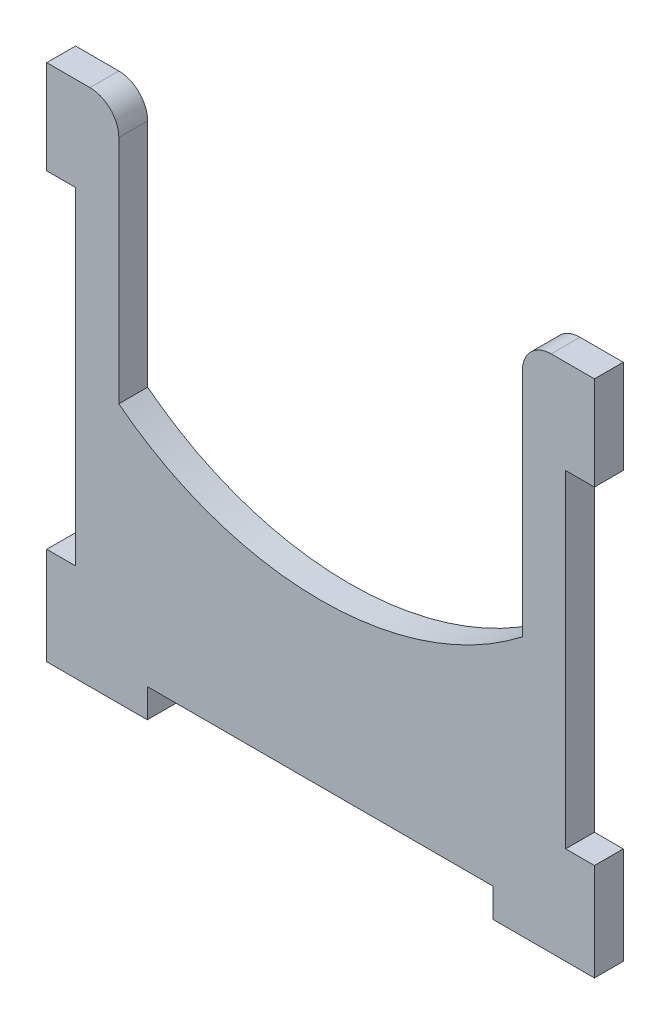
ISO-10303-21;
HEADER;
FILE_DESCRIPTION(('STEP AP214'),'2;1');
FILE_NAME('part.step','',(''),(''),'','','');
FILE_SCHEMA(('AUTOMOTIVE_DESIGN { 1 0 10303 214 1 1 1 1 }'));
ENDSEC;
DATA;
#1=APPLICATION_CONTEXT('core data for automotive mechanical design processes');
#2=APPLICATION_PROTOCOL_DEFINITION('international standard','automotive_design',2000,#1);
#3=PRODUCT_CONTEXT('',#1,'mechanical');
#4=PRODUCT('Part','Part','',(#3));
#5=PRODUCT_RELATED_PRODUCT_CATEGORY('part','',(#4));
#6=PRODUCT_DEFINITION_FORMATION('','',#4);
#7=PRODUCT_DEFINITION_CONTEXT('part definition',#1,'design');
#8=PRODUCT_DEFINITION('design','',#6,#7);
#9=PRODUCT_DEFINITION_SHAPE('','',#8);
#10=(LENGTH_UNIT() NAMED_UNIT(*) SI_UNIT(.MILLI.,.METRE.));
#11=(NAMED_UNIT(*) PLANE_ANGLE_UNIT() SI_UNIT($,.RADIAN.));
#12=(NAMED_UNIT(*) SI_UNIT($,.STERADIAN.) SOLID_ANGLE_UNIT());
#13=UNCERTAINTY_MEASURE_WITH_UNIT(LENGTH_MEASURE(1.E-05),#10,'distance_accuracy_value','');
#14=(GEOMETRIC_REPRESENTATION_CONTEXT(3) GLOBAL_UNCERTAINTY_ASSIGNED_CONTEXT((#13)) GLOBAL_UNIT_ASSIGNED_CONTEXT((#10,
#11,#12)) REPRESENTATION_CONTEXT('',''));
#15=CARTESIAN_POINT('',(0.,0.,0.));
#16=DIRECTION('',(0.,0.,1.));
#17=DIRECTION('',(1.,0.,0.));
#18=AXIS2_PLACEMENT_3D('',#15,#16,#17);
#19=CARTESIAN_POINT('',(0.,80.0783413746152,5.));
#20=DIRECTION('',(0.,1.,0.));
#21=DIRECTION('',(0.,0.,1.));
#22=AXIS2_PLACEMENT_3D('',#19,#20,#21);
#23=PLANE('',#22);
#24=DIRECTION('',(1.,0.,0.));
#25=VECTOR('',#24,1.);
#26=CARTESIAN_POINT('',(0.,80.0783413746152,0.));
#27=LINE('',#26,#25);
#28=CARTESIAN_POINT('',(26.1216712285328,80.0783413746152,0.));
#29=VERTEX_POINT('',#28);
#30=CARTESIAN_POINT('',(33.6216712285327,80.0783413746152,0.));
#31=VERTEX_POINT('',#30);
#32=EDGE_CURVE('E215',#29,#31,#27,.T.);
#33=ORIENTED_EDGE('',*,*,#32,.F.);
#34=DIRECTION('',(0.,0.,-1.));
#35=VECTOR('',#34,1.);
#36=CARTESIAN_POINT('',(26.1216712285328,80.0783413746152,5.));
#37=LINE('',#36,#35);
#38=CARTESIAN_POINT('',(26.1216712285328,80.0783413746152,5.));
#39=VERTEX_POINT('',#38);
#40=EDGE_CURVE('E11',#39,#29,#37,.T.);
#41=ORIENTED_EDGE('',*,*,#40,.F.);
#42=DIRECTION('',(1.,0.,0.));
#43=VECTOR('',#42,1.);
#44=CARTESIAN_POINT('',(0.,80.0783413746152,5.));
#45=LINE('',#44,#43);
#46=CARTESIAN_POINT('',(33.6216712285327,80.0783413746152,5.));
#47=VERTEX_POINT('',#46);
#48=EDGE_CURVE('E270',#39,#47,#45,.T.);
#49=ORIENTED_EDGE('',*,*,#48,.T.);
#50=DIRECTION('',(0.,0.,-1.));
#51=VECTOR('',#50,1.);
#52=CARTESIAN_POINT('',(33.6216712285327,80.0783413746152,5.));
#53=LINE('',#52,#51);
#54=EDGE_CURVE('E51',#47,#31,#53,.T.);
#55=ORIENTED_EDGE('',*,*,#54,.T.);
#56=EDGE_LOOP('',(#33,#41,#49,#55));
#57=FACE_BOUND('',#56,.T.);
#58=ADVANCED_FACE('F35',(#57),#23,.T.);
#59=CARTESIAN_POINT('',(26.1216712285327,75.0783413746152,5.));
#60=DIRECTION('',(0.,0.,-1.));
#61=DIRECTION('',(-1.,0.,0.));
#62=AXIS2_PLACEMENT_3D('',#59,#60,#61);
#63=CYLINDRICAL_SURFACE('',#62,5.);
#64=CARTESIAN_POINT('',(26.1216712285327,75.0783413746152,0.));
#65=DIRECTION('',(0.,0.,1.));
#66=DIRECTION('',(1.,0.,0.));
#67=AXIS2_PLACEMENT_3D('',#64,#65,#66);
#68=CIRCLE('',#67,5.);
#69=CARTESIAN_POINT('',(21.1216712285327,75.0783413746152,0.));
#70=VERTEX_POINT('',#69);
#71=EDGE_CURVE('E217',#29,#70,#68,.T.);
#72=ORIENTED_EDGE('',*,*,#71,.T.);
#73=DIRECTION('',(0.,0.,-1.));
#74=VECTOR('',#73,1.);
#75=CARTESIAN_POINT('',(21.1216712285327,75.0783413746152,5.));
#76=LINE('',#75,#74);
#77=CARTESIAN_POINT('',(21.1216712285327,75.0783413746152,5.));
#78=VERTEX_POINT('',#77);
#79=EDGE_CURVE('E43',#78,#70,#76,.T.);
#80=ORIENTED_EDGE('',*,*,#79,.F.);
#81=CARTESIAN_POINT('',(26.1216712285327,75.0783413746152,5.));
#82=DIRECTION('',(0.,0.,1.));
#83=DIRECTION('',(1.,0.,0.));
#84=AXIS2_PLACEMENT_3D('',#81,#82,#83);
#85=CIRCLE('',#84,5.);
#86=EDGE_CURVE('E333',#39,#78,#85,.T.);
#87=ORIENTED_EDGE('',*,*,#86,.F.);
#88=ORIENTED_EDGE('',*,*,#40,.T.);
#89=EDGE_LOOP('',(#72,#80,#87,#88));
#90=FACE_BOUND('',#89,.T.);
#91=ADVANCED_FACE('F321',(#90),#63,.T.);
#92=CARTESIAN_POINT('',(21.1216712285328,0.,5.));
#93=DIRECTION('',(-1.,0.,0.));
#94=DIRECTION('',(0.,-1.,0.));
#95=AXIS2_PLACEMENT_3D('',#92,#93,#94);
#96=PLANE('',#95);
#97=DIRECTION('',(0.,1.,0.));
#98=VECTOR('',#97,1.);
#99=CARTESIAN_POINT('',(21.1216712285328,0.,0.));
#100=LINE('',#99,#98);
#101=CARTESIAN_POINT('',(21.1216712285327,35.0783413746152,0.));
#102=VERTEX_POINT('',#101);
#103=EDGE_CURVE('E220',#102,#70,#100,.T.);
#104=ORIENTED_EDGE('',*,*,#103,.F.);
#105=DIRECTION('',(0.,0.,-1.));
#106=VECTOR('',#105,1.);
#107=CARTESIAN_POINT('',(21.1216712285327,35.0783413746152,5.));
#108=LINE('',#107,#106);
#109=CARTESIAN_POINT('',(21.1216712285327,35.0783413746152,5.));
#110=VERTEX_POINT('',#109);
#111=EDGE_CURVE('E311',#110,#102,#108,.T.);
#112=ORIENTED_EDGE('',*,*,#111,.F.);
#113=DIRECTION('',(0.,1.,0.));
#114=VECTOR('',#113,1.);
#115=CARTESIAN_POINT('',(21.1216712285328,0.,5.));
#116=LINE('',#115,#114);
#117=EDGE_CURVE('E318',#110,#78,#116,.T.);
#118=ORIENTED_EDGE('',*,*,#117,.T.);
#119=ORIENTED_EDGE('',*,*,#79,.T.);
#120=EDGE_LOOP('',(#104,#112,#118,#119));
#121=FACE_BOUND('',#120,.T.);
#122=ADVANCED_FACE('F316',(#121),#96,.T.);
#123=CARTESIAN_POINT('',(-13.8783287714673,80.120008041282,5.));
#124=DIRECTION('',(0.,0.,-1.));
#125=DIRECTION('',(-1.,0.,0.));
#126=AXIS2_PLACEMENT_3D('',#123,#124,#125);
#127=CYLINDRICAL_SURFACE('',#126,57.0416666666667);
#128=CARTESIAN_POINT('',(-13.8783287714673,80.120008041282,0.));
#129=DIRECTION('',(0.,0.,1.));
#130=DIRECTION('',(1.,0.,0.));
#131=AXIS2_PLACEMENT_3D('',#128,#129,#130);
#132=CIRCLE('',#131,57.0416666666667);
#133=CARTESIAN_POINT('',(-48.8783287714673,35.0783413746152,0.));
#134=VERTEX_POINT('',#133);
#135=EDGE_CURVE('E223',#134,#102,#132,.T.);
#136=ORIENTED_EDGE('',*,*,#135,.F.);
#137=DIRECTION('',(0.,0.,-1.));
#138=VECTOR('',#137,1.);
#139=CARTESIAN_POINT('',(-48.8783287714673,35.0783413746152,5.));
#140=LINE('',#139,#138);
#141=CARTESIAN_POINT('',(-48.8783287714673,35.0783413746152,5.));
#142=VERTEX_POINT('',#141);
#143=EDGE_CURVE('E309',#142,#134,#140,.T.);
#144=ORIENTED_EDGE('',*,*,#143,.F.);
#145=CARTESIAN_POINT('',(-13.8783287714673,80.120008041282,5.));
#146=DIRECTION('',(0.,0.,1.));
#147=DIRECTION('',(1.,0.,0.));
#148=AXIS2_PLACEMENT_3D('',#145,#146,#147);
#149=CIRCLE('',#148,57.0416666666667);
#150=EDGE_CURVE('E332',#142,#110,#149,.T.);
#151=ORIENTED_EDGE('',*,*,#150,.T.);
#152=ORIENTED_EDGE('',*,*,#111,.T.);
#153=EDGE_LOOP('',(#136,#144,#151,#152));
#154=FACE_BOUND('',#153,.T.);
#155=ADVANCED_FACE('F328',(#154),#127,.F.);
#156=CARTESIAN_POINT('',(-48.8783287714673,0.,5.));
#157=DIRECTION('',(-1.,0.,0.));
#158=DIRECTION('',(0.,0.,1.));
#159=AXIS2_PLACEMENT_3D('',#156,#157,#158);
#160=PLANE('',#159);
#161=DIRECTION('',(0.,1.,0.));
#162=VECTOR('',#161,1.);
#163=CARTESIAN_POINT('',(-48.8783287714673,0.,0.));
#164=LINE('',#163,#162);
#165=CARTESIAN_POINT('',(-48.8783287714673,75.0783413746152,0.));
#166=VERTEX_POINT('',#165);
#167=EDGE_CURVE('E226',#134,#166,#164,.T.);
#168=ORIENTED_EDGE('',*,*,#167,.T.);
#169=DIRECTION('',(0.,0.,-1.));
#170=VECTOR('',#169,1.);
#171=CARTESIAN_POINT('',(-48.8783287714673,75.0783413746152,5.));
#172=LINE('',#171,#170);
#173=CARTESIAN_POINT('',(-48.8783287714673,75.0783413746152,5.));
#174=VERTEX_POINT('',#173);
#175=EDGE_CURVE('E306',#174,#166,#172,.T.);
#176=ORIENTED_EDGE('',*,*,#175,.F.);
#177=DIRECTION('',(0.,1.,0.));
#178=VECTOR('',#177,1.);
#179=CARTESIAN_POINT('',(-48.8783287714673,0.,5.));
#180=LINE('',#179,#178);
#181=EDGE_CURVE('E335',#142,#174,#180,.T.);
#182=ORIENTED_EDGE('',*,*,#181,.F.);
#183=ORIENTED_EDGE('',*,*,#143,.T.);
#184=EDGE_LOOP('',(#168,#176,#182,#183));
#185=FACE_BOUND('',#184,.T.);
#186=ADVANCED_FACE('F397',(#185),#160,.F.);
#187=CARTESIAN_POINT('',(-53.8783287714673,75.0783413746152,5.));
#188=DIRECTION('',(0.,0.,-1.));
#189=DIRECTION('',(-1.,0.,0.));
#190=AXIS2_PLACEMENT_3D('',#187,#188,#189);
#191=CYLINDRICAL_SURFACE('',#190,5.);
#192=CARTESIAN_POINT('',(-53.8783287714673,75.0783413746152,0.));
#193=DIRECTION('',(0.,0.,1.));
#194=DIRECTION('',(1.,0.,0.));
#195=AXIS2_PLACEMENT_3D('',#192,#193,#194);
#196=CIRCLE('',#195,5.);
#197=CARTESIAN_POINT('',(-53.8783287714673,80.0783413746152,0.));
#198=VERTEX_POINT('',#197);
#199=EDGE_CURVE('E228',#166,#198,#196,.T.);
#200=ORIENTED_EDGE('',*,*,#199,.T.);
#201=DIRECTION('',(0.,0.,-1.));
#202=VECTOR('',#201,1.);
#203=CARTESIAN_POINT('',(-53.8783287714673,80.0783413746152,5.));
#204=LINE('',#203,#202);
#205=CARTESIAN_POINT('',(-53.8783287714673,80.0783413746152,5.));
#206=VERTEX_POINT('',#205);
#207=EDGE_CURVE('E304',#206,#198,#204,.T.);
#208=ORIENTED_EDGE('',*,*,#207,.F.);
#209=CARTESIAN_POINT('',(-53.8783287714673,75.0783413746152,5.));
#210=DIRECTION('',(0.,0.,1.));
#211=DIRECTION('',(1.,0.,0.));
#212=AXIS2_PLACEMENT_3D('',#209,#210,#211);
#213=CIRCLE('',#212,5.);
#214=EDGE_CURVE('E341',#174,#206,#213,.T.);
#215=ORIENTED_EDGE('',*,*,#214,.F.);
#216=ORIENTED_EDGE('',*,*,#175,.T.);
#217=EDGE_LOOP('',(#200,#208,#215,#216));
#218=FACE_BOUND('',#217,.T.);
#219=ADVANCED_FACE('F400',(#218),#191,.T.);
#220=CARTESIAN_POINT('',(1.48174697279819E-13,80.0783413746151,5.));
#221=DIRECTION('',(0.,1.,0.));
#222=DIRECTION('',(-1.,0.,0.));
#223=AXIS2_PLACEMENT_3D('',#220,#221,#222);
#224=PLANE('',#223);
#225=DIRECTION('',(1.,0.,0.));
#226=VECTOR('',#225,1.);
#227=CARTESIAN_POINT('',(1.48174697279819E-13,80.0783413746151,0.));
#228=LINE('',#227,#226);
#229=CARTESIAN_POINT('',(-61.3783287714673,80.0783413746152,0.));
#230=VERTEX_POINT('',#229);
#231=EDGE_CURVE('E231',#230,#198,#228,.T.);
#232=ORIENTED_EDGE('',*,*,#231,.F.);
#233=DIRECTION('',(0.,0.,-1.));
#234=VECTOR('',#233,1.);
#235=CARTESIAN_POINT('',(-61.3783287714673,80.0783413746152,5.));
#236=LINE('',#235,#234);
#237=CARTESIAN_POINT('',(-61.3783287714673,80.0783413746152,5.));
#238=VERTEX_POINT('',#237);
#239=EDGE_CURVE('E302',#238,#230,#236,.T.);
#240=ORIENTED_EDGE('',*,*,#239,.F.);
#241=DIRECTION('',(1.,0.,0.));
#242=VECTOR('',#241,1.);
#243=CARTESIAN_POINT('',(1.48174697279819E-13,80.0783413746151,5.));
#244=LINE('',#243,#242);
#245=EDGE_CURVE('E343',#238,#206,#244,.T.);
#246=ORIENTED_EDGE('',*,*,#245,.T.);
#247=ORIENTED_EDGE('',*,*,#207,.T.);
#248=EDGE_LOOP('',(#232,#240,#246,#247));
#249=FACE_BOUND('',#248,.T.);
#250=ADVANCED_FACE('F404',(#249),#224,.T.);
#251=CARTESIAN_POINT('',(-61.3783287714673,0.,5.));
#252=DIRECTION('',(1.,0.,0.));
#253=DIRECTION('',(0.,0.,-1.));
#254=AXIS2_PLACEMENT_3D('',#251,#252,#253);
#255=PLANE('',#254);
#256=DIRECTION('',(0.,-1.,0.));
#257=VECTOR('',#256,1.);
#258=CARTESIAN_POINT('',(-61.3783287714673,0.,0.));
#259=LINE('',#258,#257);
#260=CARTESIAN_POINT('',(-61.3783287714673,63.8192391119679,0.));
#261=VERTEX_POINT('',#260);
#262=EDGE_CURVE('E234',#230,#261,#259,.T.);
#263=ORIENTED_EDGE('',*,*,#262,.T.);
#264=DIRECTION('',(0.,0.,-1.));
#265=VECTOR('',#264,1.);
#266=CARTESIAN_POINT('',(-61.3783287714673,63.8192391119679,5.));
#267=LINE('',#266,#265);
#268=CARTESIAN_POINT('',(-61.3783287714673,63.8192391119679,5.));
#269=VERTEX_POINT('',#268);
#270=EDGE_CURVE('E299',#269,#261,#267,.T.);
#271=ORIENTED_EDGE('',*,*,#270,.F.);
#272=DIRECTION('',(0.,-1.,0.));
#273=VECTOR('',#272,1.);
#274=CARTESIAN_POINT('',(-61.3783287714673,0.,5.));
#275=LINE('',#274,#273);
#276=EDGE_CURVE('E346',#238,#269,#275,.T.);
#277=ORIENTED_EDGE('',*,*,#276,.F.);
#278=ORIENTED_EDGE('',*,*,#239,.T.);
#279=EDGE_LOOP('',(#263,#271,#277,#278));
#280=FACE_BOUND('',#279,.T.);
#281=ADVANCED_FACE('F408',(#280),#255,.F.);
#282=CARTESIAN_POINT('',(1.77133971690412E-13,63.8192391119677,5.));
#283=DIRECTION('',(0.,1.,0.));
#284=DIRECTION('',(-1.,0.,0.));
#285=AXIS2_PLACEMENT_3D('',#282,#283,#284);
#286=PLANE('',#285);
#287=DIRECTION('',(1.,0.,0.));
#288=VECTOR('',#287,1.);
#289=CARTESIAN_POINT('',(1.77133971690412E-13,63.8192391119677,0.));
#290=LINE('',#289,#288);
#291=CARTESIAN_POINT('',(-56.3783287714673,63.8192391119679,0.));
#292=VERTEX_POINT('',#291);
#293=EDGE_CURVE('E236',#261,#292,#290,.T.);
#294=ORIENTED_EDGE('',*,*,#293,.T.);
#295=DIRECTION('',(0.,0.,-1.));
#296=VECTOR('',#295,1.);
#297=CARTESIAN_POINT('',(-56.3783287714673,63.8192391119679,5.));
#298=LINE('',#297,#296);
#299=CARTESIAN_POINT('',(-56.3783287714673,63.8192391119679,5.));
#300=VERTEX_POINT('',#299);
#301=EDGE_CURVE('E296',#300,#292,#298,.T.);
#302=ORIENTED_EDGE('',*,*,#301,.F.);
#303=DIRECTION('',(1.,0.,0.));
#304=VECTOR('',#303,1.);
#305=CARTESIAN_POINT('',(1.77133971690412E-13,63.8192391119677,5.));
#306=LINE('',#305,#304);
#307=EDGE_CURVE('E348',#269,#300,#306,.T.);
#308=ORIENTED_EDGE('',*,*,#307,.F.);
#309=ORIENTED_EDGE('',*,*,#270,.T.);
#310=EDGE_LOOP('',(#294,#302,#308,#309));
#311=FACE_BOUND('',#310,.T.);
#312=ADVANCED_FACE('F412',(#311),#286,.F.);
#313=CARTESIAN_POINT('',(-56.3783287714673,0.,5.));
#314=DIRECTION('',(1.,0.,0.));
#315=DIRECTION('',(0.,1.,0.));
#316=AXIS2_PLACEMENT_3D('',#313,#314,#315);
#317=PLANE('',#316);
#318=DIRECTION('',(0.,-1.,0.));
#319=VECTOR('',#318,1.);
#320=CARTESIAN_POINT('',(-56.3783287714673,0.,0.));
#321=LINE('',#320,#319);
#322=CARTESIAN_POINT('',(-56.3783287714673,6.97713384880996,0.));
#323=VERTEX_POINT('',#322);
#324=EDGE_CURVE('E238',#292,#323,#321,.T.);
#325=ORIENTED_EDGE('',*,*,#324,.T.);
#326=DIRECTION('',(0.,0.,-1.));
#327=VECTOR('',#326,1.);
#328=CARTESIAN_POINT('',(-56.3783287714673,6.97713384880996,5.));
#329=LINE('',#328,#327);
#330=CARTESIAN_POINT('',(-56.3783287714673,6.97713384880996,5.));
#331=VERTEX_POINT('',#330);
#332=EDGE_CURVE('E293',#331,#323,#329,.T.);
#333=ORIENTED_EDGE('',*,*,#332,.F.);
#334=DIRECTION('',(0.,-1.,0.));
#335=VECTOR('',#334,1.);
#336=CARTESIAN_POINT('',(-56.3783287714673,0.,5.));
#337=LINE('',#336,#335);
#338=EDGE_CURVE('E350',#300,#331,#337,.T.);
#339=ORIENTED_EDGE('',*,*,#338,.F.);
#340=ORIENTED_EDGE('',*,*,#301,.T.);
#341=EDGE_LOOP('',(#325,#333,#339,#340));
#342=FACE_BOUND('',#341,.T.);
#343=ADVANCED_FACE('F416',(#342),#317,.F.);
#344=CARTESIAN_POINT('',(0.,6.9771338488098,5.));
#345=DIRECTION('',(0.,-1.,0.));
#346=DIRECTION('',(1.,0.,0.));
#347=AXIS2_PLACEMENT_3D('',#344,#345,#346);
#348=PLANE('',#347);
#349=DIRECTION('',(-1.,0.,0.));
#350=VECTOR('',#349,1.);
#351=CARTESIAN_POINT('',(0.,6.9771338488098,0.));
#352=LINE('',#351,#350);
#353=CARTESIAN_POINT('',(-61.3783287714673,6.97713384880997,0.));
#354=VERTEX_POINT('',#353);
#355=EDGE_CURVE('E240',#323,#354,#352,.T.);
#356=ORIENTED_EDGE('',*,*,#355,.T.);
#357=DIRECTION('',(0.,0.,-1.));
#358=VECTOR('',#357,1.);
#359=CARTESIAN_POINT('',(-61.3783287714673,6.97713384880997,5.));
#360=LINE('',#359,#358);
#361=CARTESIAN_POINT('',(-61.3783287714673,6.97713384880997,5.));
#362=VERTEX_POINT('',#361);
#363=EDGE_CURVE('E290',#362,#354,#360,.T.);
#364=ORIENTED_EDGE('',*,*,#363,.F.);
#365=DIRECTION('',(-1.,0.,0.));
#366=VECTOR('',#365,1.);
#367=CARTESIAN_POINT('',(0.,6.9771338488098,5.));
#368=LINE('',#367,#366);
#369=EDGE_CURVE('E352',#331,#362,#368,.T.);
#370=ORIENTED_EDGE('',*,*,#369,.F.);
#371=ORIENTED_EDGE('',*,*,#332,.T.);
#372=EDGE_LOOP('',(#356,#364,#370,#371));
#373=FACE_BOUND('',#372,.T.);
#374=ADVANCED_FACE('F420',(#373),#348,.F.);
#375=CARTESIAN_POINT('',(-61.3783287714673,0.,5.));
#376=DIRECTION('',(1.,0.,0.));
#377=DIRECTION('',(0.,0.,-1.));
#378=AXIS2_PLACEMENT_3D('',#375,#376,#377);
#379=PLANE('',#378);
#380=DIRECTION('',(0.,-1.,0.));
#381=VECTOR('',#380,1.);
#382=CARTESIAN_POINT('',(-61.3783287714673,0.,0.));
#383=LINE('',#382,#381);
#384=CARTESIAN_POINT('',(-61.3783287714673,-9.92165862538479,0.));
#385=VERTEX_POINT('',#384);
#386=EDGE_CURVE('E242',#354,#385,#383,.T.);
#387=ORIENTED_EDGE('',*,*,#386,.T.);
#388=DIRECTION('',(0.,0.,-1.));
#389=VECTOR('',#388,1.);
#390=CARTESIAN_POINT('',(-61.3783287714673,-9.92165862538479,5.));
#391=LINE('',#390,#389);
#392=CARTESIAN_POINT('',(-61.3783287714673,-9.92165862538479,5.));
#393=VERTEX_POINT('',#392);
#394=EDGE_CURVE('E287',#393,#385,#391,.T.);
#395=ORIENTED_EDGE('',*,*,#394,.F.);
#396=DIRECTION('',(0.,-1.,0.));
#397=VECTOR('',#396,1.);
#398=CARTESIAN_POINT('',(-61.3783287714673,0.,5.));
#399=LINE('',#398,#397);
#400=EDGE_CURVE('E354',#362,#393,#399,.T.);
#401=ORIENTED_EDGE('',*,*,#400,.F.);
#402=ORIENTED_EDGE('',*,*,#363,.T.);
#403=EDGE_LOOP('',(#387,#395,#401,#402));
#404=FACE_BOUND('',#403,.T.);
#405=ADVANCED_FACE('F424',(#404),#379,.F.);
#406=CARTESIAN_POINT('',(0.,-9.92165862538479,5.));
#407=DIRECTION('',(0.,1.,0.));
#408=DIRECTION('',(0.,0.,1.));
#409=AXIS2_PLACEMENT_3D('',#406,#407,#408);
#410=PLANE('',#409);
#411=DIRECTION('',(1.,0.,0.));
#412=VECTOR('',#411,1.);
#413=CARTESIAN_POINT('',(0.,-9.92165862538479,0.));
#414=LINE('',#413,#412);
#415=CARTESIAN_POINT('',(-43.9394540585279,-9.92165862538479,0.));
#416=VERTEX_POINT('',#415);
#417=EDGE_CURVE('E244',#385,#416,#414,.T.);
#418=ORIENTED_EDGE('',*,*,#417,.T.);
#419=DIRECTION('',(0.,0.,-1.));
#420=VECTOR('',#419,1.);
#421=CARTESIAN_POINT('',(-43.9394540585279,-9.92165862538479,5.));
#422=LINE('',#421,#420);
#423=CARTESIAN_POINT('',(-43.9394540585279,-9.92165862538479,5.));
#424=VERTEX_POINT('',#423);
#425=EDGE_CURVE('E285',#424,#416,#422,.T.);
#426=ORIENTED_EDGE('',*,*,#425,.F.);
#427=DIRECTION('',(1.,0.,0.));
#428=VECTOR('',#427,1.);
#429=CARTESIAN_POINT('',(0.,-9.92165862538479,5.));
#430=LINE('',#429,#428);
#431=EDGE_CURVE('E356',#393,#424,#430,.T.);
#432=ORIENTED_EDGE('',*,*,#431,.F.);
#433=ORIENTED_EDGE('',*,*,#394,.T.);
#434=EDGE_LOOP('',(#418,#426,#432,#433));
#435=FACE_BOUND('',#434,.T.);
#436=ADVANCED_FACE('F428',(#435),#410,.F.);
#437=CARTESIAN_POINT('',(-43.9394540585279,0.,5.));
#438=DIRECTION('',(1.,0.,0.));
#439=DIRECTION('',(0.,0.,-1.));
#440=AXIS2_PLACEMENT_3D('',#437,#438,#439);
#441=PLANE('',#440);
#442=DIRECTION('',(0.,-1.,0.));
#443=VECTOR('',#442,1.);
#444=CARTESIAN_POINT('',(-43.9394540585279,0.,0.));
#445=LINE('',#444,#443);
#446=CARTESIAN_POINT('',(-43.9394540585279,-4.92165862538477,0.));
#447=VERTEX_POINT('',#446);
#448=EDGE_CURVE('E247',#447,#416,#445,.T.);
#449=ORIENTED_EDGE('',*,*,#448,.F.);
#450=DIRECTION('',(0.,0.,-1.));
#451=VECTOR('',#450,1.);
#452=CARTESIAN_POINT('',(-43.9394540585279,-4.92165862538477,5.));
#453=LINE('',#452,#451);
#454=CARTESIAN_POINT('',(-43.9394540585279,-4.92165862538477,5.));
#455=VERTEX_POINT('',#454);
#456=EDGE_CURVE('E283',#455,#447,#453,.T.);
#457=ORIENTED_EDGE('',*,*,#456,.F.);
#458=DIRECTION('',(0.,-1.,0.));
#459=VECTOR('',#458,1.);
#460=CARTESIAN_POINT('',(-43.9394540585279,0.,5.));
#461=LINE('',#460,#459);
#462=EDGE_CURVE('E358',#455,#424,#461,.T.);
#463=ORIENTED_EDGE('',*,*,#462,.T.);
#464=ORIENTED_EDGE('',*,*,#425,.T.);
#465=EDGE_LOOP('',(#449,#457,#463,#464));
#466=FACE_BOUND('',#465,.T.);
#467=ADVANCED_FACE('F432',(#466),#441,.T.);
#468=CARTESIAN_POINT('',(0.,-4.92165862538477,5.));
#469=DIRECTION('',(0.,-1.,0.));
#470=DIRECTION('',(0.,0.,-1.));
#471=AXIS2_PLACEMENT_3D('',#468,#469,#470);
#472=PLANE('',#471);
#473=DIRECTION('',(-1.,0.,0.));
#474=VECTOR('',#473,1.);
#475=CARTESIAN_POINT('',(0.,-4.92165862538477,0.));
#476=LINE('',#475,#474);
#477=CARTESIAN_POINT('',(16.0605459414721,-4.92165862538477,0.));
#478=VERTEX_POINT('',#477);
#479=EDGE_CURVE('E250',#478,#447,#476,.T.);
#480=ORIENTED_EDGE('',*,*,#479,.F.);
#481=DIRECTION('',(0.,0.,-1.));
#482=VECTOR('',#481,1.);
#483=CARTESIAN_POINT('',(16.0605459414721,-4.92165862538477,5.));
#484=LINE('',#483,#482);
#485=CARTESIAN_POINT('',(16.0605459414721,-4.92165862538477,5.));
#486=VERTEX_POINT('',#485);
#487=EDGE_CURVE('E281',#486,#478,#484,.T.);
#488=ORIENTED_EDGE('',*,*,#487,.F.);
#489=DIRECTION('',(-1.,0.,0.));
#490=VECTOR('',#489,1.);
#491=CARTESIAN_POINT('',(0.,-4.92165862538477,5.));
#492=LINE('',#491,#490);
#493=EDGE_CURVE('E361',#486,#455,#492,.T.);
#494=ORIENTED_EDGE('',*,*,#493,.T.);
#495=ORIENTED_EDGE('',*,*,#456,.T.);
#496=EDGE_LOOP('',(#480,#488,#494,#495));
#497=FACE_BOUND('',#496,.T.);
#498=ADVANCED_FACE('F436',(#497),#472,.T.);
#499=CARTESIAN_POINT('',(16.0605459414721,0.,5.));
#500=DIRECTION('',(1.,0.,0.));
#501=DIRECTION('',(0.,1.,0.));
#502=AXIS2_PLACEMENT_3D('',#499,#500,#501);
#503=PLANE('',#502);
#504=DIRECTION('',(0.,-1.,0.));
#505=VECTOR('',#504,1.);
#506=CARTESIAN_POINT('',(16.0605459414721,0.,0.));
#507=LINE('',#506,#505);
#508=CARTESIAN_POINT('',(16.0605459414721,-9.92165862538479,0.));
#509=VERTEX_POINT('',#508);
#510=EDGE_CURVE('E253',#478,#509,#507,.T.);
#511=ORIENTED_EDGE('',*,*,#510,.T.);
#512=DIRECTION('',(0.,0.,-1.));
#513=VECTOR('',#512,1.);
#514=CARTESIAN_POINT('',(16.0605459414721,-9.92165862538479,5.));
#515=LINE('',#514,#513);
#516=CARTESIAN_POINT('',(16.0605459414721,-9.92165862538479,5.));
#517=VERTEX_POINT('',#516);
#518=EDGE_CURVE('E278',#517,#509,#515,.T.);
#519=ORIENTED_EDGE('',*,*,#518,.F.);
#520=DIRECTION('',(0.,-1.,0.));
#521=VECTOR('',#520,1.);
#522=CARTESIAN_POINT('',(16.0605459414721,0.,5.));
#523=LINE('',#522,#521);
#524=EDGE_CURVE('E364',#486,#517,#523,.T.);
#525=ORIENTED_EDGE('',*,*,#524,.F.);
#526=ORIENTED_EDGE('',*,*,#487,.T.);
#527=EDGE_LOOP('',(#511,#519,#525,#526));
#528=FACE_BOUND('',#527,.T.);
#529=ADVANCED_FACE('F440',(#528),#503,.F.);
#530=CARTESIAN_POINT('',(0.,-9.92165862538479,5.));
#531=DIRECTION('',(0.,1.,0.));
#532=DIRECTION('',(0.,0.,1.));
#533=AXIS2_PLACEMENT_3D('',#530,#531,#532);
#534=PLANE('',#533);
#535=DIRECTION('',(1.,0.,0.));
#536=VECTOR('',#535,1.);
#537=CARTESIAN_POINT('',(0.,-9.92165862538479,0.));
#538=LINE('',#537,#536);
#539=CARTESIAN_POINT('',(33.6216712285327,-9.92165862538479,0.));
#540=VERTEX_POINT('',#539);
#541=EDGE_CURVE('E255',#509,#540,#538,.T.);
#542=ORIENTED_EDGE('',*,*,#541,.T.);
#543=DIRECTION('',(0.,0.,-1.));
#544=VECTOR('',#543,1.);
#545=CARTESIAN_POINT('',(33.6216712285327,-9.92165862538479,5.));
#546=LINE('',#545,#544);
#547=CARTESIAN_POINT('',(33.6216712285327,-9.92165862538479,5.));
#548=VERTEX_POINT('',#547);
#549=EDGE_CURVE('E276',#548,#540,#546,.T.);
#550=ORIENTED_EDGE('',*,*,#549,.F.);
#551=DIRECTION('',(1.,0.,0.));
#552=VECTOR('',#551,1.);
#553=CARTESIAN_POINT('',(0.,-9.92165862538479,5.));
#554=LINE('',#553,#552);
#555=EDGE_CURVE('E366',#517,#548,#554,.T.);
#556=ORIENTED_EDGE('',*,*,#555,.F.);
#557=ORIENTED_EDGE('',*,*,#518,.T.);
#558=EDGE_LOOP('',(#542,#550,#556,#557));
#559=FACE_BOUND('',#558,.T.);
#560=ADVANCED_FACE('F444',(#559),#534,.F.);
#561=CARTESIAN_POINT('',(33.6216712285327,0.,5.));
#562=DIRECTION('',(1.,0.,0.));
#563=DIRECTION('',(0.,0.,-1.));
#564=AXIS2_PLACEMENT_3D('',#561,#562,#563);
#565=PLANE('',#564);
#566=DIRECTION('',(0.,-1.,0.));
#567=VECTOR('',#566,1.);
#568=CARTESIAN_POINT('',(33.6216712285327,0.,0.));
#569=LINE('',#568,#567);
#570=CARTESIAN_POINT('',(33.6216712285327,6.97713384880998,0.));
#571=VERTEX_POINT('',#570);
#572=EDGE_CURVE('E258',#571,#540,#569,.T.);
#573=ORIENTED_EDGE('',*,*,#572,.F.);
#574=DIRECTION('',(0.,0.,-1.));
#575=VECTOR('',#574,1.);
#576=CARTESIAN_POINT('',(33.6216712285327,6.97713384880998,5.));
#577=LINE('',#576,#575);
#578=CARTESIAN_POINT('',(33.6216712285327,6.97713384880998,5.));
#579=VERTEX_POINT('',#578);
#580=EDGE_CURVE('E274',#579,#571,#577,.T.);
#581=ORIENTED_EDGE('',*,*,#580,.F.);
#582=DIRECTION('',(0.,-1.,0.));
#583=VECTOR('',#582,1.);
#584=CARTESIAN_POINT('',(33.6216712285327,0.,5.));
#585=LINE('',#584,#583);
#586=EDGE_CURVE('E210',#579,#548,#585,.T.);
#587=ORIENTED_EDGE('',*,*,#586,.T.);
#588=ORIENTED_EDGE('',*,*,#549,.T.);
#589=EDGE_LOOP('',(#573,#581,#587,#588));
#590=FACE_BOUND('',#589,.T.);
#591=ADVANCED_FACE('F370',(#590),#565,.T.);
#592=CARTESIAN_POINT('',(0.,6.97713384880988,5.));
#593=DIRECTION('',(0.,1.,0.));
#594=DIRECTION('',(-1.,0.,0.));
#595=AXIS2_PLACEMENT_3D('',#592,#593,#594);
#596=PLANE('',#595);
#597=DIRECTION('',(1.,0.,0.));
#598=VECTOR('',#597,1.);
#599=CARTESIAN_POINT('',(0.,6.97713384880988,0.));
#600=LINE('',#599,#598);
#601=CARTESIAN_POINT('',(28.6216712285327,6.97713384880996,0.));
#602=VERTEX_POINT('',#601);
#603=EDGE_CURVE('E261',#602,#571,#600,.T.);
#604=ORIENTED_EDGE('',*,*,#603,.F.);
#605=DIRECTION('',(0.,0.,-1.));
#606=VECTOR('',#605,1.);
#607=CARTESIAN_POINT('',(28.6216712285327,6.97713384880996,5.));
#608=LINE('',#607,#606);
#609=CARTESIAN_POINT('',(28.6216712285327,6.97713384880996,5.));
#610=VERTEX_POINT('',#609);
#611=EDGE_CURVE('E195',#610,#602,#608,.T.);
#612=ORIENTED_EDGE('',*,*,#611,.F.);
#613=DIRECTION('',(1.,0.,0.));
#614=VECTOR('',#613,1.);
#615=CARTESIAN_POINT('',(0.,6.97713384880988,5.));
#616=LINE('',#615,#614);
#617=EDGE_CURVE('E208',#610,#579,#616,.T.);
#618=ORIENTED_EDGE('',*,*,#617,.T.);
#619=ORIENTED_EDGE('',*,*,#580,.T.);
#620=EDGE_LOOP('',(#604,#612,#618,#619));
#621=FACE_BOUND('',#620,.T.);
#622=ADVANCED_FACE('F375',(#621),#596,.T.);
#623=CARTESIAN_POINT('',(28.6216712285327,0.,5.));
#624=DIRECTION('',(1.,0.,0.));
#625=DIRECTION('',(0.,1.,0.));
#626=AXIS2_PLACEMENT_3D('',#623,#624,#625);
#627=PLANE('',#626);
#628=DIRECTION('',(0.,-1.,0.));
#629=VECTOR('',#628,1.);
#630=CARTESIAN_POINT('',(28.6216712285327,0.,0.));
#631=LINE('',#630,#629);
#632=CARTESIAN_POINT('',(28.6216712285327,63.8192391119679,0.));
#633=VERTEX_POINT('',#632);
#634=EDGE_CURVE('E192',#633,#602,#631,.T.);
#635=ORIENTED_EDGE('',*,*,#634,.F.);
#636=DIRECTION('',(0.,0.,-1.));
#637=VECTOR('',#636,1.);
#638=CARTESIAN_POINT('',(28.6216712285327,63.8192391119679,5.));
#639=LINE('',#638,#637);
#640=CARTESIAN_POINT('',(28.6216712285327,63.8192391119679,5.));
#641=VERTEX_POINT('',#640);
#642=EDGE_CURVE('E186',#641,#633,#639,.T.);
#643=ORIENTED_EDGE('',*,*,#642,.F.);
#644=DIRECTION('',(0.,-1.,0.));
#645=VECTOR('',#644,1.);
#646=CARTESIAN_POINT('',(28.6216712285327,0.,5.));
#647=LINE('',#646,#645);
#648=EDGE_CURVE('E190',#641,#610,#647,.T.);
#649=ORIENTED_EDGE('',*,*,#648,.T.);
#650=ORIENTED_EDGE('',*,*,#611,.T.);
#651=EDGE_LOOP('',(#635,#643,#649,#650));
#652=FACE_BOUND('',#651,.T.);
#653=ADVANCED_FACE('F188',(#652),#627,.T.);
#654=CARTESIAN_POINT('',(-1.77133971690413E-13,63.8192391119678,5.));
#655=DIRECTION('',(0.,1.,0.));
#656=DIRECTION('',(-1.,0.,0.));
#657=AXIS2_PLACEMENT_3D('',#654,#655,#656);
#658=PLANE('',#657);
#659=DIRECTION('',(1.,0.,0.));
#660=VECTOR('',#659,1.);
#661=CARTESIAN_POINT('',(-1.77133971690413E-13,63.8192391119678,0.));
#662=LINE('',#661,#660);
#663=CARTESIAN_POINT('',(33.6216712285327,63.8192391119679,0.));
#664=VERTEX_POINT('',#663);
#665=EDGE_CURVE('E265',#633,#664,#662,.T.);
#666=ORIENTED_EDGE('',*,*,#665,.T.);
#667=DIRECTION('',(0.,0.,-1.));
#668=VECTOR('',#667,1.);
#669=CARTESIAN_POINT('',(33.6216712285327,63.8192391119679,5.));
#670=LINE('',#669,#668);
#671=CARTESIAN_POINT('',(33.6216712285327,63.8192391119679,5.));
#672=VERTEX_POINT('',#671);
#673=EDGE_CURVE('E119',#672,#664,#670,.T.);
#674=ORIENTED_EDGE('',*,*,#673,.F.);
#675=DIRECTION('',(1.,0.,0.));
#676=VECTOR('',#675,1.);
#677=CARTESIAN_POINT('',(-1.77133971690413E-13,63.8192391119678,5.));
#678=LINE('',#677,#676);
#679=EDGE_CURVE('E197',#641,#672,#678,.T.);
#680=ORIENTED_EDGE('',*,*,#679,.F.);
#681=ORIENTED_EDGE('',*,*,#642,.T.);
#682=EDGE_LOOP('',(#666,#674,#680,#681));
#683=FACE_BOUND('',#682,.T.);
#684=ADVANCED_FACE('F198',(#683),#658,.F.);
#685=CARTESIAN_POINT('',(33.6216712285327,0.,5.));
#686=DIRECTION('',(1.,0.,0.));
#687=DIRECTION('',(0.,0.,-1.));
#688=AXIS2_PLACEMENT_3D('',#685,#686,#687);
#689=PLANE('',#688);
#690=DIRECTION('',(0.,-1.,0.));
#691=VECTOR('',#690,1.);
#692=CARTESIAN_POINT('',(33.6216712285327,0.,0.));
#693=LINE('',#692,#691);
#694=EDGE_CURVE('E267',#31,#664,#693,.T.);
#695=ORIENTED_EDGE('',*,*,#694,.F.);
#696=ORIENTED_EDGE('',*,*,#54,.F.);
#697=DIRECTION('',(0.,-1.,0.));
#698=VECTOR('',#697,1.);
#699=CARTESIAN_POINT('',(33.6216712285327,0.,5.));
#700=LINE('',#699,#698);
#701=EDGE_CURVE('E201',#47,#672,#700,.T.);
#702=ORIENTED_EDGE('',*,*,#701,.T.);
#703=ORIENTED_EDGE('',*,*,#673,.T.);
#704=EDGE_LOOP('',(#695,#696,#702,#703));
#705=FACE_BOUND('',#704,.T.);
#706=ADVANCED_FACE('F376',(#705),#689,.T.);
#707=CARTESIAN_POINT('',(0.,0.,5.));
#708=DIRECTION('',(0.,0.,1.));
#709=DIRECTION('',(1.,0.,0.));
#710=AXIS2_PLACEMENT_3D('',#707,#708,#709);
#711=PLANE('',#710);
#712=ORIENTED_EDGE('',*,*,#48,.F.);
#713=ORIENTED_EDGE('',*,*,#86,.T.);
#714=ORIENTED_EDGE('',*,*,#117,.F.);
#715=ORIENTED_EDGE('',*,*,#150,.F.);
#716=ORIENTED_EDGE('',*,*,#181,.T.);
#717=ORIENTED_EDGE('',*,*,#214,.T.);
#718=ORIENTED_EDGE('',*,*,#245,.F.);
#719=ORIENTED_EDGE('',*,*,#276,.T.);
#720=ORIENTED_EDGE('',*,*,#307,.T.);
#721=ORIENTED_EDGE('',*,*,#338,.T.);
#722=ORIENTED_EDGE('',*,*,#369,.T.);
#723=ORIENTED_EDGE('',*,*,#400,.T.);
#724=ORIENTED_EDGE('',*,*,#431,.T.);
#725=ORIENTED_EDGE('',*,*,#462,.F.);
#726=ORIENTED_EDGE('',*,*,#493,.F.);
#727=ORIENTED_EDGE('',*,*,#524,.T.);
#728=ORIENTED_EDGE('',*,*,#555,.T.);
#729=ORIENTED_EDGE('',*,*,#586,.F.);
#730=ORIENTED_EDGE('',*,*,#617,.F.);
#731=ORIENTED_EDGE('',*,*,#648,.F.);
#732=ORIENTED_EDGE('',*,*,#679,.T.);
#733=ORIENTED_EDGE('',*,*,#701,.F.);
#734=EDGE_LOOP('',(#712,#713,#714,#715,#716,#717,#718,#719,#720,#721,#722,#723,#724,#725,#726,
#727,#728,#729,#730,#731,#732,#733));
#735=FACE_BOUND('',#734,.T.);
#736=ADVANCED_FACE('F205',(#735),#711,.T.);
#737=CARTESIAN_POINT('',(0.,0.,0.));
#738=DIRECTION('',(0.,0.,1.));
#739=DIRECTION('',(1.,0.,0.));
#740=AXIS2_PLACEMENT_3D('',#737,#738,#739);
#741=PLANE('',#740);
#742=ORIENTED_EDGE('',*,*,#32,.T.);
#743=ORIENTED_EDGE('',*,*,#694,.T.);
#744=ORIENTED_EDGE('',*,*,#665,.F.);
#745=ORIENTED_EDGE('',*,*,#634,.T.);
#746=ORIENTED_EDGE('',*,*,#603,.T.);
#747=ORIENTED_EDGE('',*,*,#572,.T.);
#748=ORIENTED_EDGE('',*,*,#541,.F.);
#749=ORIENTED_EDGE('',*,*,#510,.F.);
#750=ORIENTED_EDGE('',*,*,#479,.T.);
#751=ORIENTED_EDGE('',*,*,#448,.T.);
#752=ORIENTED_EDGE('',*,*,#417,.F.);
#753=ORIENTED_EDGE('',*,*,#386,.F.);
#754=ORIENTED_EDGE('',*,*,#355,.F.);
#755=ORIENTED_EDGE('',*,*,#324,.F.);
#756=ORIENTED_EDGE('',*,*,#293,.F.);
#757=ORIENTED_EDGE('',*,*,#262,.F.);
#758=ORIENTED_EDGE('',*,*,#231,.T.);
#759=ORIENTED_EDGE('',*,*,#199,.F.);
#760=ORIENTED_EDGE('',*,*,#167,.F.);
#761=ORIENTED_EDGE('',*,*,#135,.T.);
#762=ORIENTED_EDGE('',*,*,#103,.T.);
#763=ORIENTED_EDGE('',*,*,#71,.F.);
#764=EDGE_LOOP('',(#742,#743,#744,#745,#746,#747,#748,#749,#750,#751,#752,#753,#754,#755,#756,
#757,#758,#759,#760,#761,#762,#763));
#765=FACE_BOUND('',#764,.T.);
#766=ADVANCED_FACE('F323',(#765),#741,.F.);
#767=CLOSED_SHELL('',(#58,#91,#122,#155,#186,#219,#250,#281,#312,#343,#374,#405,#436,#467,#498,
#529,#560,#591,#622,#653,#684,#706,#736,#766));
#768=MANIFOLD_SOLID_BREP('B2',#767);
#769=ADVANCED_BREP_SHAPE_REPRESENTATION('',(#18,#768),#14);
#770=SHAPE_DEFINITION_REPRESENTATION(#9,#769);
ENDSEC;
END-ISO-10303-21;
